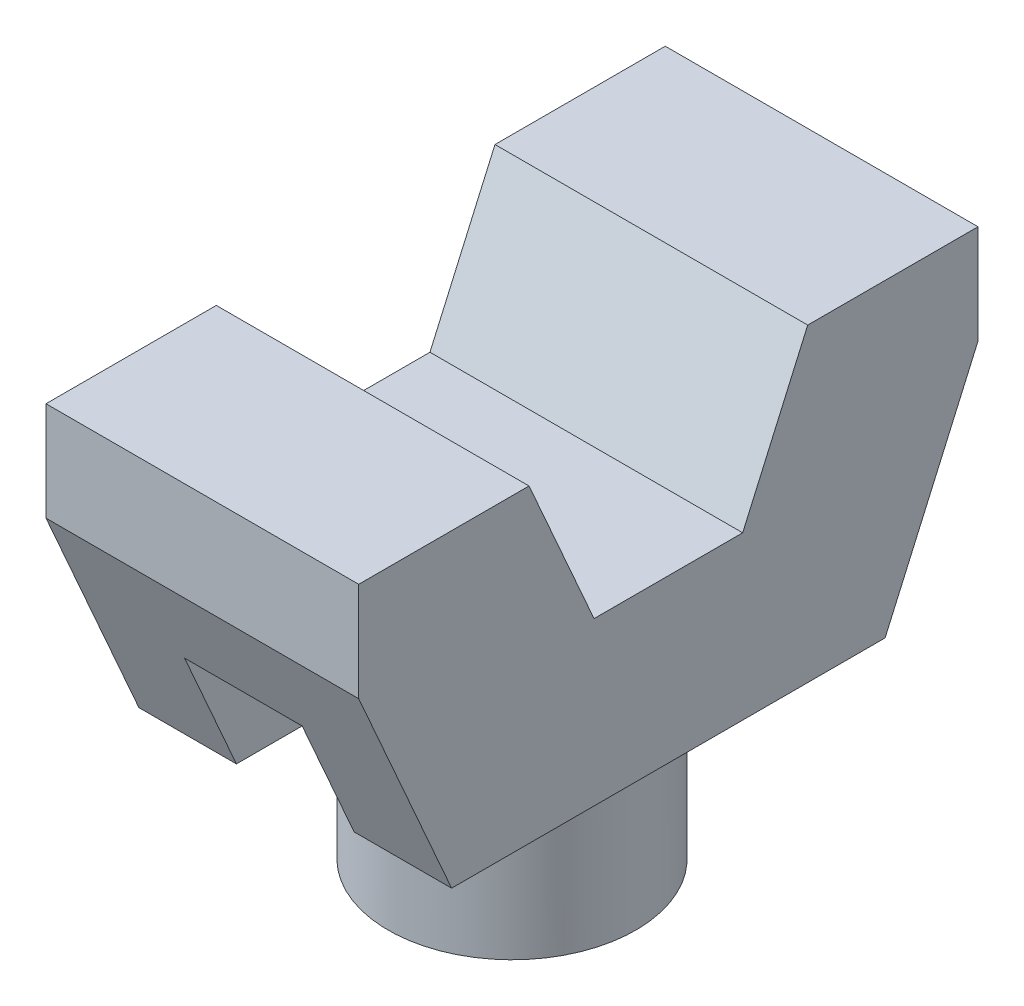
ISO-10303-21;
HEADER;
FILE_DESCRIPTION(('STEP AP214'),'2;1');
FILE_NAME('part.step','',(''),(''),'','','');
FILE_SCHEMA(('AUTOMOTIVE_DESIGN { 1 0 10303 214 1 1 1 1 }'));
ENDSEC;
DATA;
#1=APPLICATION_CONTEXT('core data for automotive mechanical design processes');
#2=APPLICATION_PROTOCOL_DEFINITION('international standard','automotive_design',2000,#1);
#3=PRODUCT_CONTEXT('',#1,'mechanical');
#4=PRODUCT('Part','Part','',(#3));
#5=PRODUCT_RELATED_PRODUCT_CATEGORY('part','',(#4));
#6=PRODUCT_DEFINITION_FORMATION('','',#4);
#7=PRODUCT_DEFINITION_CONTEXT('part definition',#1,'design');
#8=PRODUCT_DEFINITION('design','',#6,#7);
#9=PRODUCT_DEFINITION_SHAPE('','',#8);
#10=(LENGTH_UNIT() NAMED_UNIT(*) SI_UNIT(.MILLI.,.METRE.));
#11=(NAMED_UNIT(*) PLANE_ANGLE_UNIT() SI_UNIT($,.RADIAN.));
#12=(NAMED_UNIT(*) SI_UNIT($,.STERADIAN.) SOLID_ANGLE_UNIT());
#13=UNCERTAINTY_MEASURE_WITH_UNIT(LENGTH_MEASURE(1.E-05),#10,'distance_accuracy_value','');
#14=(GEOMETRIC_REPRESENTATION_CONTEXT(3) GLOBAL_UNCERTAINTY_ASSIGNED_CONTEXT((#13)) GLOBAL_UNIT_ASSIGNED_CONTEXT((#10,
#11,#12)) REPRESENTATION_CONTEXT('',''));
#15=CARTESIAN_POINT('',(0.,0.,0.));
#16=DIRECTION('',(0.,0.,1.));
#17=DIRECTION('',(1.,0.,0.));
#18=AXIS2_PLACEMENT_3D('',#15,#16,#17);
#19=CARTESIAN_POINT('',(-50.5,-26.2,-35.));
#20=DIRECTION('',(0.,-1.,0.));
#21=DIRECTION('',(0.,0.,-1.));
#22=AXIS2_PLACEMENT_3D('',#19,#20,#21);
#23=PLANE('',#22);
#24=DIRECTION('',(1.,0.,0.));
#25=VECTOR('',#24,1.);
#26=CARTESIAN_POINT('',(-50.5,-26.2,-35.));
#27=LINE('',#26,#25);
#28=CARTESIAN_POINT('',(-50.5,-26.2,-35.));
#29=VERTEX_POINT('',#28);
#30=CARTESIAN_POINT('',(-34.75,-26.2,-35.));
#31=VERTEX_POINT('',#30);
#32=EDGE_CURVE('E199',#29,#31,#27,.T.);
#33=ORIENTED_EDGE('',*,*,#32,.T.);
#34=DIRECTION('',(0.,0.,-1.));
#35=VECTOR('',#34,1.);
#36=CARTESIAN_POINT('',(-34.75,-26.2,-20.));
#37=LINE('',#36,#35);
#38=CARTESIAN_POINT('',(-34.75,-26.2,-20.));
#39=VERTEX_POINT('',#38);
#40=EDGE_CURVE('E190',#39,#31,#37,.T.);
#41=ORIENTED_EDGE('',*,*,#40,.F.);
#42=DIRECTION('',(-1.,0.,0.));
#43=VECTOR('',#42,1.);
#44=CARTESIAN_POINT('',(-15.75,-26.2,-20.));
#45=LINE('',#44,#43);
#46=CARTESIAN_POINT('',(-25.25,-26.2,-20.));
#47=VERTEX_POINT('',#46);
#48=EDGE_CURVE('E175',#47,#39,#45,.T.);
#49=ORIENTED_EDGE('',*,*,#48,.F.);
#50=CARTESIAN_POINT('',(-25.25,-26.2,0.));
#51=DIRECTION('',(0.,-1.,0.));
#52=DIRECTION('',(0.,0.,-1.));
#53=AXIS2_PLACEMENT_3D('',#50,#51,#52);
#54=CIRCLE('',#53,20.);
#55=CARTESIAN_POINT('',(-25.25,-26.2,20.));
#56=VERTEX_POINT('',#55);
#57=EDGE_CURVE('E251',#56,#47,#54,.T.);
#58=ORIENTED_EDGE('',*,*,#57,.F.);
#59=DIRECTION('',(1.,0.,0.));
#60=VECTOR('',#59,1.);
#61=CARTESIAN_POINT('',(-34.75,-26.2,20.));
#62=LINE('',#61,#60);
#63=CARTESIAN_POINT('',(-34.75,-26.2,20.));
#64=VERTEX_POINT('',#63);
#65=EDGE_CURVE('E222',#64,#56,#62,.T.);
#66=ORIENTED_EDGE('',*,*,#65,.F.);
#67=DIRECTION('',(0.,0.,1.));
#68=VECTOR('',#67,1.);
#69=CARTESIAN_POINT('',(-34.75,-26.2,20.));
#70=LINE('',#69,#68);
#71=CARTESIAN_POINT('',(-34.75,-26.2,35.));
#72=VERTEX_POINT('',#71);
#73=EDGE_CURVE('E232',#64,#72,#70,.T.);
#74=ORIENTED_EDGE('',*,*,#73,.T.);
#75=DIRECTION('',(1.,0.,0.));
#76=VECTOR('',#75,1.);
#77=CARTESIAN_POINT('',(-50.5,-26.2,35.));
#78=LINE('',#77,#76);
#79=CARTESIAN_POINT('',(-50.5,-26.2,35.));
#80=VERTEX_POINT('',#79);
#81=EDGE_CURVE('E354',#80,#72,#78,.T.);
#82=ORIENTED_EDGE('',*,*,#81,.F.);
#83=DIRECTION('',(0.,0.,-1.));
#84=VECTOR('',#83,1.);
#85=CARTESIAN_POINT('',(-50.5,-26.2,-35.));
#86=LINE('',#85,#84);
#87=EDGE_CURVE('E274',#80,#29,#86,.T.);
#88=ORIENTED_EDGE('',*,*,#87,.T.);
#89=EDGE_LOOP('',(#33,#41,#49,#58,#66,#74,#82,#88));
#90=FACE_BOUND('',#89,.T.);
#91=ADVANCED_FACE('F42',(#90),#23,.T.);
#92=CARTESIAN_POINT('',(-50.5,23.8,22.5));
#93=DIRECTION('',(0.,0.403640206576294,-0.914917801572932));
#94=DIRECTION('',(0.,0.914917801572932,0.403640206576294));
#95=AXIS2_PLACEMENT_3D('',#92,#93,#94);
#96=PLANE('',#95);
#97=DIRECTION('',(0.,0.914917801572932,0.403640206576294));
#98=VECTOR('',#97,1.);
#99=CARTESIAN_POINT('',(0.,23.8,22.5));
#100=LINE('',#99,#98);
#101=CARTESIAN_POINT('',(0.,0.,12.));
#102=VERTEX_POINT('',#101);
#103=CARTESIAN_POINT('',(0.,23.8,22.5));
#104=VERTEX_POINT('',#103);
#105=EDGE_CURVE('E250',#102,#104,#100,.T.);
#106=ORIENTED_EDGE('',*,*,#105,.F.);
#107=DIRECTION('',(1.,0.,0.));
#108=VECTOR('',#107,1.);
#109=CARTESIAN_POINT('',(-50.5,0.,12.));
#110=LINE('',#109,#108);
#111=CARTESIAN_POINT('',(-50.5,0.,12.));
#112=VERTEX_POINT('',#111);
#113=EDGE_CURVE('E336',#112,#102,#110,.T.);
#114=ORIENTED_EDGE('',*,*,#113,.F.);
#115=DIRECTION('',(0.,0.914917801572932,0.403640206576294));
#116=VECTOR('',#115,1.);
#117=CARTESIAN_POINT('',(-50.5,23.8,22.5));
#118=LINE('',#117,#116);
#119=CARTESIAN_POINT('',(-50.5,23.8,22.5));
#120=VERTEX_POINT('',#119);
#121=EDGE_CURVE('E257',#112,#120,#118,.T.);
#122=ORIENTED_EDGE('',*,*,#121,.T.);
#123=DIRECTION('',(1.,0.,0.));
#124=VECTOR('',#123,1.);
#125=CARTESIAN_POINT('',(-50.5,23.8,22.5));
#126=LINE('',#125,#124);
#127=EDGE_CURVE('E297',#120,#104,#126,.T.);
#128=ORIENTED_EDGE('',*,*,#127,.T.);
#129=EDGE_LOOP('',(#106,#114,#122,#128));
#130=FACE_BOUND('',#129,.T.);
#131=ADVANCED_FACE('F44',(#130),#96,.T.);
#132=CARTESIAN_POINT('',(-50.5,0.,12.));
#133=DIRECTION('',(0.,1.,0.));
#134=DIRECTION('',(0.,0.,1.));
#135=AXIS2_PLACEMENT_3D('',#132,#133,#134);
#136=PLANE('',#135);
#137=DIRECTION('',(0.,0.,1.));
#138=VECTOR('',#137,1.);
#139=CARTESIAN_POINT('',(0.,0.,12.));
#140=LINE('',#139,#138);
#141=CARTESIAN_POINT('',(0.,0.,-12.));
#142=VERTEX_POINT('',#141);
#143=EDGE_CURVE('E262',#142,#102,#140,.T.);
#144=ORIENTED_EDGE('',*,*,#143,.F.);
#145=DIRECTION('',(1.,0.,0.));
#146=VECTOR('',#145,1.);
#147=CARTESIAN_POINT('',(-50.5,0.,-12.));
#148=LINE('',#147,#146);
#149=CARTESIAN_POINT('',(-50.5,0.,-12.));
#150=VERTEX_POINT('',#149);
#151=EDGE_CURVE('E339',#150,#142,#148,.T.);
#152=ORIENTED_EDGE('',*,*,#151,.F.);
#153=DIRECTION('',(0.,0.,1.));
#154=VECTOR('',#153,1.);
#155=CARTESIAN_POINT('',(-50.5,0.,12.));
#156=LINE('',#155,#154);
#157=EDGE_CURVE('E293',#150,#112,#156,.T.);
#158=ORIENTED_EDGE('',*,*,#157,.T.);
#159=ORIENTED_EDGE('',*,*,#113,.T.);
#160=EDGE_LOOP('',(#144,#152,#158,#159));
#161=FACE_BOUND('',#160,.T.);
#162=ADVANCED_FACE('F400',(#161),#136,.T.);
#163=CARTESIAN_POINT('',(-50.5,0.,-12.));
#164=DIRECTION('',(0.,0.403640206576293,0.914917801572932));
#165=DIRECTION('',(0.,-0.914917801572932,0.403640206576294));
#166=AXIS2_PLACEMENT_3D('',#163,#164,#165);
#167=PLANE('',#166);
#168=DIRECTION('',(0.,-0.914917801572932,0.403640206576294));
#169=VECTOR('',#168,1.);
#170=CARTESIAN_POINT('',(0.,0.,-12.));
#171=LINE('',#170,#169);
#172=CARTESIAN_POINT('',(0.,23.8,-22.5));
#173=VERTEX_POINT('',#172);
#174=EDGE_CURVE('E329',#173,#142,#171,.T.);
#175=ORIENTED_EDGE('',*,*,#174,.F.);
#176=DIRECTION('',(1.,0.,0.));
#177=VECTOR('',#176,1.);
#178=CARTESIAN_POINT('',(-50.5,23.8,-22.5));
#179=LINE('',#178,#177);
#180=CARTESIAN_POINT('',(-50.5,23.8,-22.5));
#181=VERTEX_POINT('',#180);
#182=EDGE_CURVE('E342',#181,#173,#179,.T.);
#183=ORIENTED_EDGE('',*,*,#182,.F.);
#184=DIRECTION('',(0.,-0.914917801572932,0.403640206576294));
#185=VECTOR('',#184,1.);
#186=CARTESIAN_POINT('',(-50.5,0.,-12.));
#187=LINE('',#186,#185);
#188=EDGE_CURVE('E289',#181,#150,#187,.T.);
#189=ORIENTED_EDGE('',*,*,#188,.T.);
#190=ORIENTED_EDGE('',*,*,#151,.T.);
#191=EDGE_LOOP('',(#175,#183,#189,#190));
#192=FACE_BOUND('',#191,.T.);
#193=ADVANCED_FACE('F470',(#192),#167,.T.);
#194=CARTESIAN_POINT('',(-50.5,23.8,-22.5));
#195=DIRECTION('',(0.,1.,0.));
#196=DIRECTION('',(0.,0.,1.));
#197=AXIS2_PLACEMENT_3D('',#194,#195,#196);
#198=PLANE('',#197);
#199=DIRECTION('',(0.,0.,1.));
#200=VECTOR('',#199,1.);
#201=CARTESIAN_POINT('',(0.,23.8,-22.5));
#202=LINE('',#201,#200);
#203=CARTESIAN_POINT('',(0.,23.8,-50.));
#204=VERTEX_POINT('',#203);
#205=EDGE_CURVE('E325',#204,#173,#202,.T.);
#206=ORIENTED_EDGE('',*,*,#205,.F.);
#207=DIRECTION('',(1.,0.,0.));
#208=VECTOR('',#207,1.);
#209=CARTESIAN_POINT('',(-50.5,23.8,-50.));
#210=LINE('',#209,#208);
#211=CARTESIAN_POINT('',(-50.5,23.8,-50.));
#212=VERTEX_POINT('',#211);
#213=EDGE_CURVE('E345',#212,#204,#210,.T.);
#214=ORIENTED_EDGE('',*,*,#213,.F.);
#215=DIRECTION('',(0.,0.,1.));
#216=VECTOR('',#215,1.);
#217=CARTESIAN_POINT('',(-50.5,23.8,-22.5));
#218=LINE('',#217,#216);
#219=EDGE_CURVE('E285',#212,#181,#218,.T.);
#220=ORIENTED_EDGE('',*,*,#219,.T.);
#221=ORIENTED_EDGE('',*,*,#182,.T.);
#222=EDGE_LOOP('',(#206,#214,#220,#221));
#223=FACE_BOUND('',#222,.T.);
#224=ADVANCED_FACE('F407',(#223),#198,.T.);
#225=CARTESIAN_POINT('',(-50.5,23.8,-50.));
#226=DIRECTION('',(0.,0.,-1.));
#227=DIRECTION('',(-1.,0.,0.));
#228=AXIS2_PLACEMENT_3D('',#225,#226,#227);
#229=PLANE('',#228);
#230=DIRECTION('',(0.,1.,0.));
#231=VECTOR('',#230,1.);
#232=CARTESIAN_POINT('',(0.,23.8,-50.));
#233=LINE('',#232,#231);
#234=CARTESIAN_POINT('',(0.,7.79999999999999,-50.));
#235=VERTEX_POINT('',#234);
#236=EDGE_CURVE('E321',#235,#204,#233,.T.);
#237=ORIENTED_EDGE('',*,*,#236,.F.);
#238=DIRECTION('',(1.,0.,0.));
#239=VECTOR('',#238,1.);
#240=CARTESIAN_POINT('',(-50.5,7.79999999999999,-50.));
#241=LINE('',#240,#239);
#242=CARTESIAN_POINT('',(-50.5,7.79999999999999,-50.));
#243=VERTEX_POINT('',#242);
#244=EDGE_CURVE('E348',#243,#235,#241,.T.);
#245=ORIENTED_EDGE('',*,*,#244,.F.);
#246=DIRECTION('',(0.,1.,0.));
#247=VECTOR('',#246,1.);
#248=CARTESIAN_POINT('',(-50.5,23.8,-50.));
#249=LINE('',#248,#247);
#250=EDGE_CURVE('E281',#243,#212,#249,.T.);
#251=ORIENTED_EDGE('',*,*,#250,.T.);
#252=ORIENTED_EDGE('',*,*,#213,.T.);
#253=EDGE_LOOP('',(#237,#245,#251,#252));
#254=FACE_BOUND('',#253,.T.);
#255=ADVANCED_FACE('F411',(#254),#229,.T.);
#256=CARTESIAN_POINT('',(-50.5,7.79999999999999,-50.));
#257=DIRECTION('',(0.,-0.403640206576294,-0.914917801572932));
#258=DIRECTION('',(0.,0.914917801572932,-0.403640206576294));
#259=AXIS2_PLACEMENT_3D('',#256,#257,#258);
#260=PLANE('',#259);
#261=DIRECTION('',(0.,-0.914917801572932,0.403640206576294));
#262=VECTOR('',#261,1.);
#263=CARTESIAN_POINT('',(-15.75,7.79999999999999,-50.));
#264=LINE('',#263,#262);
#265=CARTESIAN_POINT('',(-15.75,-7.20000000000001,-43.3823529411765));
#266=VERTEX_POINT('',#265);
#267=CARTESIAN_POINT('',(-15.75,-26.2,-35.));
#268=VERTEX_POINT('',#267);
#269=EDGE_CURVE('E214',#266,#268,#264,.T.);
#270=ORIENTED_EDGE('',*,*,#269,.F.);
#271=DIRECTION('',(-1.,0.,0.));
#272=VECTOR('',#271,1.);
#273=CARTESIAN_POINT('',(-50.5,-7.20000000000001,-43.3823529411765));
#274=LINE('',#273,#272);
#275=CARTESIAN_POINT('',(-34.75,-7.20000000000001,-43.3823529411765));
#276=VERTEX_POINT('',#275);
#277=EDGE_CURVE('E11',#266,#276,#274,.T.);
#278=ORIENTED_EDGE('',*,*,#277,.T.);
#279=DIRECTION('',(0.,-0.914917801572932,0.403640206576294));
#280=VECTOR('',#279,1.);
#281=CARTESIAN_POINT('',(-34.75,7.79999999999999,-50.));
#282=LINE('',#281,#280);
#283=EDGE_CURVE('E211',#276,#31,#282,.T.);
#284=ORIENTED_EDGE('',*,*,#283,.T.);
#285=ORIENTED_EDGE('',*,*,#32,.F.);
#286=DIRECTION('',(0.,0.914917801572932,-0.403640206576294));
#287=VECTOR('',#286,1.);
#288=CARTESIAN_POINT('',(-50.5,7.79999999999999,-50.));
#289=LINE('',#288,#287);
#290=EDGE_CURVE('E277',#29,#243,#289,.T.);
#291=ORIENTED_EDGE('',*,*,#290,.T.);
#292=ORIENTED_EDGE('',*,*,#244,.T.);
#293=DIRECTION('',(0.,0.914917801572932,-0.403640206576294));
#294=VECTOR('',#293,1.);
#295=CARTESIAN_POINT('',(0.,7.79999999999999,-50.));
#296=LINE('',#295,#294);
#297=CARTESIAN_POINT('',(0.,-26.2,-35.));
#298=VERTEX_POINT('',#297);
#299=EDGE_CURVE('E317',#298,#235,#296,.T.);
#300=ORIENTED_EDGE('',*,*,#299,.F.);
#301=EDGE_CURVE('E353',#268,#298,#27,.T.);
#302=ORIENTED_EDGE('',*,*,#301,.F.);
#303=EDGE_LOOP('',(#270,#278,#284,#285,#291,#292,#300,#302));
#304=FACE_BOUND('',#303,.T.);
#305=ADVANCED_FACE('F414',(#304),#260,.T.);
#306=DIRECTION('',(0.,0.,-1.));
#307=VECTOR('',#306,1.);
#308=CARTESIAN_POINT('',(-15.75,-26.2,-20.));
#309=LINE('',#308,#307);
#310=CARTESIAN_POINT('',(-15.75,-26.2,-20.));
#311=VERTEX_POINT('',#310);
#312=EDGE_CURVE('E201',#311,#268,#309,.T.);
#313=ORIENTED_EDGE('',*,*,#312,.T.);
#314=ORIENTED_EDGE('',*,*,#301,.T.);
#315=DIRECTION('',(0.,0.,-1.));
#316=VECTOR('',#315,1.);
#317=CARTESIAN_POINT('',(0.,-26.2,-35.));
#318=LINE('',#317,#316);
#319=CARTESIAN_POINT('',(0.,-26.2,35.));
#320=VERTEX_POINT('',#319);
#321=EDGE_CURVE('E313',#320,#298,#318,.T.);
#322=ORIENTED_EDGE('',*,*,#321,.F.);
#323=CARTESIAN_POINT('',(-15.75,-26.2,35.));
#324=VERTEX_POINT('',#323);
#325=EDGE_CURVE('E358',#324,#320,#78,.T.);
#326=ORIENTED_EDGE('',*,*,#325,.F.);
#327=DIRECTION('',(0.,0.,1.));
#328=VECTOR('',#327,1.);
#329=CARTESIAN_POINT('',(-15.75,-26.2,20.));
#330=LINE('',#329,#328);
#331=CARTESIAN_POINT('',(-15.75,-26.2,20.));
#332=VERTEX_POINT('',#331);
#333=EDGE_CURVE('E66',#332,#324,#330,.T.);
#334=ORIENTED_EDGE('',*,*,#333,.F.);
#335=EDGE_CURVE('E221',#56,#332,#62,.T.);
#336=ORIENTED_EDGE('',*,*,#335,.F.);
#337=EDGE_CURVE('E256',#47,#56,#54,.T.);
#338=ORIENTED_EDGE('',*,*,#337,.F.);
#339=EDGE_CURVE('E180',#311,#47,#45,.T.);
#340=ORIENTED_EDGE('',*,*,#339,.F.);
#341=EDGE_LOOP('',(#313,#314,#322,#326,#334,#336,#338,#340));
#342=FACE_BOUND('',#341,.T.);
#343=ADVANCED_FACE('F438',(#342),#23,.T.);
#344=CARTESIAN_POINT('',(-50.5,-26.2,35.));
#345=DIRECTION('',(0.,-0.403640206576293,0.914917801572932));
#346=DIRECTION('',(0.,-0.914917801572932,-0.403640206576293));
#347=AXIS2_PLACEMENT_3D('',#344,#345,#346);
#348=PLANE('',#347);
#349=DIRECTION('',(0.,-0.914917801572932,-0.403640206576293));
#350=VECTOR('',#349,1.);
#351=CARTESIAN_POINT('',(-34.75,-26.2,35.));
#352=LINE('',#351,#350);
#353=CARTESIAN_POINT('',(-34.75,-7.20000000000001,43.3823529411765));
#354=VERTEX_POINT('',#353);
#355=EDGE_CURVE('E51',#354,#72,#352,.T.);
#356=ORIENTED_EDGE('',*,*,#355,.F.);
#357=DIRECTION('',(1.,0.,0.));
#358=VECTOR('',#357,1.);
#359=CARTESIAN_POINT('',(-50.5,-7.20000000000001,43.3823529411765));
#360=LINE('',#359,#358);
#361=CARTESIAN_POINT('',(-15.75,-7.20000000000001,43.3823529411765));
#362=VERTEX_POINT('',#361);
#363=EDGE_CURVE('E369',#354,#362,#360,.T.);
#364=ORIENTED_EDGE('',*,*,#363,.T.);
#365=DIRECTION('',(0.,-0.914917801572932,-0.403640206576293));
#366=VECTOR('',#365,1.);
#367=CARTESIAN_POINT('',(-15.75,-26.2,35.));
#368=LINE('',#367,#366);
#369=EDGE_CURVE('E255',#362,#324,#368,.T.);
#370=ORIENTED_EDGE('',*,*,#369,.T.);
#371=ORIENTED_EDGE('',*,*,#325,.T.);
#372=DIRECTION('',(0.,-0.914917801572932,-0.403640206576293));
#373=VECTOR('',#372,1.);
#374=CARTESIAN_POINT('',(0.,-26.2,35.));
#375=LINE('',#374,#373);
#376=CARTESIAN_POINT('',(0.,7.8,50.));
#377=VERTEX_POINT('',#376);
#378=EDGE_CURVE('E309',#377,#320,#375,.T.);
#379=ORIENTED_EDGE('',*,*,#378,.F.);
#380=DIRECTION('',(1.,0.,0.));
#381=VECTOR('',#380,1.);
#382=CARTESIAN_POINT('',(-50.5,7.8,50.));
#383=LINE('',#382,#381);
#384=CARTESIAN_POINT('',(-50.5,7.8,50.));
#385=VERTEX_POINT('',#384);
#386=EDGE_CURVE('E359',#385,#377,#383,.T.);
#387=ORIENTED_EDGE('',*,*,#386,.F.);
#388=DIRECTION('',(0.,-0.914917801572932,-0.403640206576293));
#389=VECTOR('',#388,1.);
#390=CARTESIAN_POINT('',(-50.5,-26.2,35.));
#391=LINE('',#390,#389);
#392=EDGE_CURVE('E270',#385,#80,#391,.T.);
#393=ORIENTED_EDGE('',*,*,#392,.T.);
#394=ORIENTED_EDGE('',*,*,#81,.T.);
#395=EDGE_LOOP('',(#356,#364,#370,#371,#379,#387,#393,#394));
#396=FACE_BOUND('',#395,.T.);
#397=ADVANCED_FACE('F380',(#396),#348,.T.);
#398=CARTESIAN_POINT('',(-50.5,7.8,50.));
#399=DIRECTION('',(0.,0.,1.));
#400=DIRECTION('',(1.,0.,0.));
#401=AXIS2_PLACEMENT_3D('',#398,#399,#400);
#402=PLANE('',#401);
#403=DIRECTION('',(0.,-1.,0.));
#404=VECTOR('',#403,1.);
#405=CARTESIAN_POINT('',(0.,7.8,50.));
#406=LINE('',#405,#404);
#407=CARTESIAN_POINT('',(0.,23.8,50.));
#408=VERTEX_POINT('',#407);
#409=EDGE_CURVE('E305',#408,#377,#406,.T.);
#410=ORIENTED_EDGE('',*,*,#409,.F.);
#411=DIRECTION('',(1.,0.,0.));
#412=VECTOR('',#411,1.);
#413=CARTESIAN_POINT('',(-50.5,23.8,50.));
#414=LINE('',#413,#412);
#415=CARTESIAN_POINT('',(-50.5,23.8,50.));
#416=VERTEX_POINT('',#415);
#417=EDGE_CURVE('E362',#416,#408,#414,.T.);
#418=ORIENTED_EDGE('',*,*,#417,.F.);
#419=DIRECTION('',(0.,-1.,0.));
#420=VECTOR('',#419,1.);
#421=CARTESIAN_POINT('',(-50.5,7.8,50.));
#422=LINE('',#421,#420);
#423=EDGE_CURVE('E266',#416,#385,#422,.T.);
#424=ORIENTED_EDGE('',*,*,#423,.T.);
#425=ORIENTED_EDGE('',*,*,#386,.T.);
#426=EDGE_LOOP('',(#410,#418,#424,#425));
#427=FACE_BOUND('',#426,.T.);
#428=ADVANCED_FACE('F391',(#427),#402,.T.);
#429=CARTESIAN_POINT('',(-50.5,23.8,50.));
#430=DIRECTION('',(0.,1.,0.));
#431=DIRECTION('',(0.,0.,1.));
#432=AXIS2_PLACEMENT_3D('',#429,#430,#431);
#433=PLANE('',#432);
#434=DIRECTION('',(0.,0.,1.));
#435=VECTOR('',#434,1.);
#436=CARTESIAN_POINT('',(0.,23.8,50.));
#437=LINE('',#436,#435);
#438=EDGE_CURVE('E301',#104,#408,#437,.T.);
#439=ORIENTED_EDGE('',*,*,#438,.F.);
#440=ORIENTED_EDGE('',*,*,#127,.F.);
#441=DIRECTION('',(0.,0.,1.));
#442=VECTOR('',#441,1.);
#443=CARTESIAN_POINT('',(-50.5,23.8,50.));
#444=LINE('',#443,#442);
#445=EDGE_CURVE('E261',#120,#416,#444,.T.);
#446=ORIENTED_EDGE('',*,*,#445,.T.);
#447=ORIENTED_EDGE('',*,*,#417,.T.);
#448=EDGE_LOOP('',(#439,#440,#446,#447));
#449=FACE_BOUND('',#448,.T.);
#450=ADVANCED_FACE('F394',(#449),#433,.T.);
#451=CARTESIAN_POINT('',(-50.5,0.,0.));
#452=DIRECTION('',(1.,0.,0.));
#453=DIRECTION('',(0.,0.,-1.));
#454=AXIS2_PLACEMENT_3D('',#451,#452,#453);
#455=PLANE('',#454);
#456=ORIENTED_EDGE('',*,*,#121,.F.);
#457=ORIENTED_EDGE('',*,*,#157,.F.);
#458=ORIENTED_EDGE('',*,*,#188,.F.);
#459=ORIENTED_EDGE('',*,*,#219,.F.);
#460=ORIENTED_EDGE('',*,*,#250,.F.);
#461=ORIENTED_EDGE('',*,*,#290,.F.);
#462=ORIENTED_EDGE('',*,*,#87,.F.);
#463=ORIENTED_EDGE('',*,*,#392,.F.);
#464=ORIENTED_EDGE('',*,*,#423,.F.);
#465=ORIENTED_EDGE('',*,*,#445,.F.);
#466=EDGE_LOOP('',(#456,#457,#458,#459,#460,#461,#462,#463,#464,#465));
#467=FACE_BOUND('',#466,.T.);
#468=ADVANCED_FACE('F386',(#467),#455,.F.);
#469=CARTESIAN_POINT('',(0.,0.,0.));
#470=DIRECTION('',(1.,0.,0.));
#471=DIRECTION('',(0.,0.,-1.));
#472=AXIS2_PLACEMENT_3D('',#469,#470,#471);
#473=PLANE('',#472);
#474=ORIENTED_EDGE('',*,*,#105,.T.);
#475=ORIENTED_EDGE('',*,*,#438,.T.);
#476=ORIENTED_EDGE('',*,*,#409,.T.);
#477=ORIENTED_EDGE('',*,*,#378,.T.);
#478=ORIENTED_EDGE('',*,*,#321,.T.);
#479=ORIENTED_EDGE('',*,*,#299,.T.);
#480=ORIENTED_EDGE('',*,*,#236,.T.);
#481=ORIENTED_EDGE('',*,*,#205,.T.);
#482=ORIENTED_EDGE('',*,*,#174,.T.);
#483=ORIENTED_EDGE('',*,*,#143,.T.);
#484=EDGE_LOOP('',(#474,#475,#476,#477,#478,#479,#480,#481,#482,#483));
#485=FACE_BOUND('',#484,.T.);
#486=ADVANCED_FACE('F475',(#485),#473,.T.);
#487=CARTESIAN_POINT('',(-25.25,-52.2,0.));
#488=DIRECTION('',(0.,1.,0.));
#489=DIRECTION('',(0.,0.,1.));
#490=AXIS2_PLACEMENT_3D('',#487,#488,#489);
#491=CYLINDRICAL_SURFACE('',#490,20.);
#492=CARTESIAN_POINT('',(-25.25,-52.2,0.));
#493=DIRECTION('',(0.,-1.,0.));
#494=DIRECTION('',(0.,0.,-1.));
#495=AXIS2_PLACEMENT_3D('',#492,#493,#494);
#496=CIRCLE('',#495,20.);
#497=CARTESIAN_POINT('',(-25.25,-52.2,-20.));
#498=VERTEX_POINT('',#497);
#499=EDGE_CURVE('E237',#498,#498,#496,.T.);
#500=ORIENTED_EDGE('',*,*,#499,.F.);
#501=EDGE_LOOP('',(#500));
#502=FACE_BOUND('',#501,.T.);
#503=ORIENTED_EDGE('',*,*,#57,.T.);
#504=ORIENTED_EDGE('',*,*,#337,.T.);
#505=EDGE_LOOP('',(#503,#504));
#506=FACE_BOUND('',#505,.T.);
#507=ADVANCED_FACE('F478',(#502,#506),#491,.T.);
#508=CARTESIAN_POINT('',(-25.25,-52.2,0.));
#509=DIRECTION('',(0.,-1.,0.));
#510=DIRECTION('',(0.,0.,-1.));
#511=AXIS2_PLACEMENT_3D('',#508,#509,#510);
#512=PLANE('',#511);
#513=ORIENTED_EDGE('',*,*,#499,.T.);
#514=EDGE_LOOP('',(#513));
#515=FACE_BOUND('',#514,.T.);
#516=ADVANCED_FACE('F448',(#515),#512,.T.);
#517=CARTESIAN_POINT('',(-34.75,-7.20000000000001,20.));
#518=DIRECTION('',(-1.,0.,0.));
#519=DIRECTION('',(0.,0.,1.));
#520=AXIS2_PLACEMENT_3D('',#517,#518,#519);
#521=PLANE('',#520);
#522=ORIENTED_EDGE('',*,*,#355,.T.);
#523=ORIENTED_EDGE('',*,*,#73,.F.);
#524=DIRECTION('',(0.,-1.,0.));
#525=VECTOR('',#524,1.);
#526=CARTESIAN_POINT('',(-34.75,-7.20000000000001,20.));
#527=LINE('',#526,#525);
#528=CARTESIAN_POINT('',(-34.75,-7.20000000000001,20.));
#529=VERTEX_POINT('',#528);
#530=EDGE_CURVE('E217',#529,#64,#527,.T.);
#531=ORIENTED_EDGE('',*,*,#530,.F.);
#532=DIRECTION('',(0.,0.,1.));
#533=VECTOR('',#532,1.);
#534=CARTESIAN_POINT('',(-34.75,-7.20000000000001,20.));
#535=LINE('',#534,#533);
#536=EDGE_CURVE('E233',#529,#354,#535,.T.);
#537=ORIENTED_EDGE('',*,*,#536,.T.);
#538=EDGE_LOOP('',(#522,#523,#531,#537));
#539=FACE_BOUND('',#538,.T.);
#540=ADVANCED_FACE('F375',(#539),#521,.F.);
#541=CARTESIAN_POINT('',(-34.75,-7.20000000000001,20.));
#542=DIRECTION('',(0.,-1.,0.));
#543=DIRECTION('',(0.,0.,-1.));
#544=AXIS2_PLACEMENT_3D('',#541,#542,#543);
#545=PLANE('',#544);
#546=ORIENTED_EDGE('',*,*,#536,.F.);
#547=DIRECTION('',(1.,0.,0.));
#548=VECTOR('',#547,1.);
#549=CARTESIAN_POINT('',(-34.75,-7.20000000000001,20.));
#550=LINE('',#549,#548);
#551=CARTESIAN_POINT('',(-15.75,-7.20000000000001,20.));
#552=VERTEX_POINT('',#551);
#553=EDGE_CURVE('E229',#529,#552,#550,.T.);
#554=ORIENTED_EDGE('',*,*,#553,.T.);
#555=DIRECTION('',(0.,0.,1.));
#556=VECTOR('',#555,1.);
#557=CARTESIAN_POINT('',(-15.75,-7.20000000000001,20.));
#558=LINE('',#557,#556);
#559=EDGE_CURVE('E238',#552,#362,#558,.T.);
#560=ORIENTED_EDGE('',*,*,#559,.T.);
#561=ORIENTED_EDGE('',*,*,#363,.F.);
#562=EDGE_LOOP('',(#546,#554,#560,#561));
#563=FACE_BOUND('',#562,.T.);
#564=ADVANCED_FACE('F440',(#563),#545,.T.);
#565=CARTESIAN_POINT('',(-15.75,-7.20000000000001,20.));
#566=DIRECTION('',(-1.,0.,0.));
#567=DIRECTION('',(0.,-1.,0.));
#568=AXIS2_PLACEMENT_3D('',#565,#566,#567);
#569=PLANE('',#568);
#570=ORIENTED_EDGE('',*,*,#559,.F.);
#571=DIRECTION('',(0.,-1.,0.));
#572=VECTOR('',#571,1.);
#573=CARTESIAN_POINT('',(-15.75,-7.20000000000001,20.));
#574=LINE('',#573,#572);
#575=EDGE_CURVE('E226',#552,#332,#574,.T.);
#576=ORIENTED_EDGE('',*,*,#575,.T.);
#577=ORIENTED_EDGE('',*,*,#333,.T.);
#578=ORIENTED_EDGE('',*,*,#369,.F.);
#579=EDGE_LOOP('',(#570,#576,#577,#578));
#580=FACE_BOUND('',#579,.T.);
#581=ADVANCED_FACE('F436',(#580),#569,.T.);
#582=CARTESIAN_POINT('',(0.,0.,20.));
#583=DIRECTION('',(0.,0.,1.));
#584=DIRECTION('',(1.,0.,0.));
#585=AXIS2_PLACEMENT_3D('',#582,#583,#584);
#586=PLANE('',#585);
#587=ORIENTED_EDGE('',*,*,#530,.T.);
#588=ORIENTED_EDGE('',*,*,#65,.T.);
#589=ORIENTED_EDGE('',*,*,#335,.T.);
#590=ORIENTED_EDGE('',*,*,#575,.F.);
#591=ORIENTED_EDGE('',*,*,#553,.F.);
#592=EDGE_LOOP('',(#587,#588,#589,#590,#591));
#593=FACE_BOUND('',#592,.T.);
#594=ADVANCED_FACE('F433',(#593),#586,.T.);
#595=CARTESIAN_POINT('',(-15.75,-7.20000000000001,-20.));
#596=DIRECTION('',(1.,0.,0.));
#597=DIRECTION('',(0.,1.,0.));
#598=AXIS2_PLACEMENT_3D('',#595,#596,#597);
#599=PLANE('',#598);
#600=ORIENTED_EDGE('',*,*,#269,.T.);
#601=ORIENTED_EDGE('',*,*,#312,.F.);
#602=DIRECTION('',(0.,-1.,0.));
#603=VECTOR('',#602,1.);
#604=CARTESIAN_POINT('',(-15.75,-7.20000000000001,-20.));
#605=LINE('',#604,#603);
#606=CARTESIAN_POINT('',(-15.75,-7.20000000000001,-20.));
#607=VERTEX_POINT('',#606);
#608=EDGE_CURVE('E58',#607,#311,#605,.T.);
#609=ORIENTED_EDGE('',*,*,#608,.F.);
#610=DIRECTION('',(0.,0.,-1.));
#611=VECTOR('',#610,1.);
#612=CARTESIAN_POINT('',(-15.75,-7.20000000000001,-20.));
#613=LINE('',#612,#611);
#614=EDGE_CURVE('E205',#607,#266,#613,.T.);
#615=ORIENTED_EDGE('',*,*,#614,.T.);
#616=EDGE_LOOP('',(#600,#601,#609,#615));
#617=FACE_BOUND('',#616,.T.);
#618=ADVANCED_FACE('F423',(#617),#599,.F.);
#619=CARTESIAN_POINT('',(-15.75,-7.20000000000001,-20.));
#620=DIRECTION('',(0.,-1.,0.));
#621=DIRECTION('',(0.,0.,-1.));
#622=AXIS2_PLACEMENT_3D('',#619,#620,#621);
#623=PLANE('',#622);
#624=ORIENTED_EDGE('',*,*,#614,.F.);
#625=DIRECTION('',(-1.,0.,0.));
#626=VECTOR('',#625,1.);
#627=CARTESIAN_POINT('',(-15.75,-7.20000000000001,-20.));
#628=LINE('',#627,#626);
#629=CARTESIAN_POINT('',(-34.75,-7.20000000000001,-20.));
#630=VERTEX_POINT('',#629);
#631=EDGE_CURVE('E195',#607,#630,#628,.T.);
#632=ORIENTED_EDGE('',*,*,#631,.T.);
#633=DIRECTION('',(0.,0.,-1.));
#634=VECTOR('',#633,1.);
#635=CARTESIAN_POINT('',(-34.75,-7.20000000000001,-20.));
#636=LINE('',#635,#634);
#637=EDGE_CURVE('E193',#630,#276,#636,.T.);
#638=ORIENTED_EDGE('',*,*,#637,.T.);
#639=ORIENTED_EDGE('',*,*,#277,.F.);
#640=EDGE_LOOP('',(#624,#632,#638,#639));
#641=FACE_BOUND('',#640,.T.);
#642=ADVANCED_FACE('F417',(#641),#623,.T.);
#643=CARTESIAN_POINT('',(-34.75,-7.20000000000001,-20.));
#644=DIRECTION('',(1.,0.,0.));
#645=DIRECTION('',(0.,0.,-1.));
#646=AXIS2_PLACEMENT_3D('',#643,#644,#645);
#647=PLANE('',#646);
#648=ORIENTED_EDGE('',*,*,#637,.F.);
#649=DIRECTION('',(0.,-1.,0.));
#650=VECTOR('',#649,1.);
#651=CARTESIAN_POINT('',(-34.75,-7.20000000000001,-20.));
#652=LINE('',#651,#650);
#653=EDGE_CURVE('E178',#630,#39,#652,.T.);
#654=ORIENTED_EDGE('',*,*,#653,.T.);
#655=ORIENTED_EDGE('',*,*,#40,.T.);
#656=ORIENTED_EDGE('',*,*,#283,.F.);
#657=EDGE_LOOP('',(#648,#654,#655,#656));
#658=FACE_BOUND('',#657,.T.);
#659=ADVANCED_FACE('F189',(#658),#647,.T.);
#660=CARTESIAN_POINT('',(0.,0.,-20.));
#661=DIRECTION('',(0.,0.,-1.));
#662=DIRECTION('',(-1.,0.,0.));
#663=AXIS2_PLACEMENT_3D('',#660,#661,#662);
#664=PLANE('',#663);
#665=ORIENTED_EDGE('',*,*,#608,.T.);
#666=ORIENTED_EDGE('',*,*,#339,.T.);
#667=ORIENTED_EDGE('',*,*,#48,.T.);
#668=ORIENTED_EDGE('',*,*,#653,.F.);
#669=ORIENTED_EDGE('',*,*,#631,.F.);
#670=EDGE_LOOP('',(#665,#666,#667,#668,#669));
#671=FACE_BOUND('',#670,.T.);
#672=ADVANCED_FACE('F177',(#671),#664,.T.);
#673=CLOSED_SHELL('',(#91,#131,#162,#193,#224,#255,#305,#343,#397,#428,#450,#468,#486,#507,#516,
#540,#564,#581,#594,#618,#642,#659,#672));
#674=MANIFOLD_SOLID_BREP('B2',#673);
#675=ADVANCED_BREP_SHAPE_REPRESENTATION('',(#18,#674),#14);
#676=SHAPE_DEFINITION_REPRESENTATION(#9,#675);
ENDSEC;
END-ISO-10303-21;
